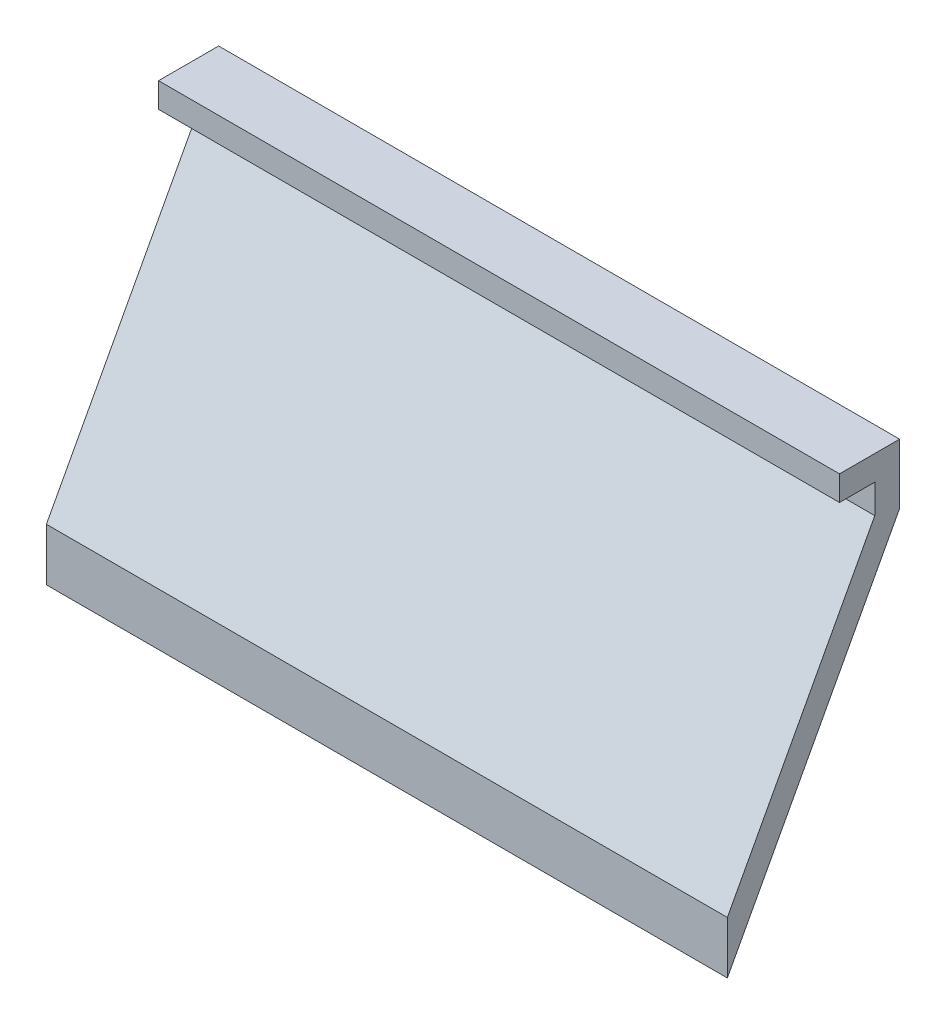
ISO-10303-21;
HEADER;
FILE_DESCRIPTION(('STEP AP214'),'2;1');
FILE_NAME('part.step','',(''),(''),'','','');
FILE_SCHEMA(('AUTOMOTIVE_DESIGN { 1 0 10303 214 1 1 1 1 }'));
ENDSEC;
DATA;
#1=APPLICATION_CONTEXT('core data for automotive mechanical design processes');
#2=APPLICATION_PROTOCOL_DEFINITION('international standard','automotive_design',2000,#1);
#3=PRODUCT_CONTEXT('',#1,'mechanical');
#4=PRODUCT('Part','Part','',(#3));
#5=PRODUCT_RELATED_PRODUCT_CATEGORY('part','',(#4));
#6=PRODUCT_DEFINITION_FORMATION('','',#4);
#7=PRODUCT_DEFINITION_CONTEXT('part definition',#1,'design');
#8=PRODUCT_DEFINITION('design','',#6,#7);
#9=PRODUCT_DEFINITION_SHAPE('','',#8);
#10=(LENGTH_UNIT() NAMED_UNIT(*) SI_UNIT(.MILLI.,.METRE.));
#11=(NAMED_UNIT(*) PLANE_ANGLE_UNIT() SI_UNIT($,.RADIAN.));
#12=(NAMED_UNIT(*) SI_UNIT($,.STERADIAN.) SOLID_ANGLE_UNIT());
#13=UNCERTAINTY_MEASURE_WITH_UNIT(LENGTH_MEASURE(1.E-05),#10,'distance_accuracy_value','');
#14=(GEOMETRIC_REPRESENTATION_CONTEXT(3) GLOBAL_UNCERTAINTY_ASSIGNED_CONTEXT((#13)) GLOBAL_UNIT_ASSIGNED_CONTEXT((#10,
#11,#12)) REPRESENTATION_CONTEXT('',''));
#15=CARTESIAN_POINT('',(0.,0.,0.));
#16=DIRECTION('',(0.,0.,1.));
#17=DIRECTION('',(1.,0.,0.));
#18=AXIS2_PLACEMENT_3D('',#15,#16,#17);
#19=CARTESIAN_POINT('',(85.,55.,-21.5));
#20=DIRECTION('',(0.,-1.,0.));
#21=DIRECTION('',(0.,0.,-1.));
#22=AXIS2_PLACEMENT_3D('',#19,#20,#21);
#23=PLANE('',#22);
#24=DIRECTION('',(0.,0.,1.));
#25=VECTOR('',#24,1.);
#26=CARTESIAN_POINT('',(-85.,55.,-21.5));
#27=LINE('',#26,#25);
#28=CARTESIAN_POINT('',(-85.,55.,-21.5));
#29=VERTEX_POINT('',#28);
#30=CARTESIAN_POINT('',(-85.,55.,-6.5));
#31=VERTEX_POINT('',#30);
#32=EDGE_CURVE('E128',#29,#31,#27,.T.);
#33=ORIENTED_EDGE('',*,*,#32,.T.);
#34=DIRECTION('',(-1.,0.,0.));
#35=VECTOR('',#34,1.);
#36=CARTESIAN_POINT('',(85.,55.,-6.5));
#37=LINE('',#36,#35);
#38=CARTESIAN_POINT('',(85.,55.,-6.5));
#39=VERTEX_POINT('',#38);
#40=EDGE_CURVE('E11',#39,#31,#37,.T.);
#41=ORIENTED_EDGE('',*,*,#40,.F.);
#42=DIRECTION('',(0.,0.,1.));
#43=VECTOR('',#42,1.);
#44=CARTESIAN_POINT('',(85.,55.,-21.5));
#45=LINE('',#44,#43);
#46=CARTESIAN_POINT('',(85.,55.,-21.5));
#47=VERTEX_POINT('',#46);
#48=EDGE_CURVE('E142',#47,#39,#45,.T.);
#49=ORIENTED_EDGE('',*,*,#48,.F.);
#50=DIRECTION('',(-1.,0.,0.));
#51=VECTOR('',#50,1.);
#52=CARTESIAN_POINT('',(85.,55.,-21.5));
#53=LINE('',#52,#51);
#54=EDGE_CURVE('E124',#47,#29,#53,.T.);
#55=ORIENTED_EDGE('',*,*,#54,.T.);
#56=EDGE_LOOP('',(#33,#41,#49,#55));
#57=FACE_BOUND('',#56,.T.);
#58=ADVANCED_FACE('F32',(#57),#23,.F.);
#59=CARTESIAN_POINT('',(85.,55.,-6.5));
#60=DIRECTION('',(0.,0.,-1.));
#61=DIRECTION('',(0.,1.,0.));
#62=AXIS2_PLACEMENT_3D('',#59,#60,#61);
#63=PLANE('',#62);
#64=DIRECTION('',(0.,-1.,0.));
#65=VECTOR('',#64,1.);
#66=CARTESIAN_POINT('',(-85.,55.,-6.5));
#67=LINE('',#66,#65);
#68=CARTESIAN_POINT('',(-85.,48.8,-6.5));
#69=VERTEX_POINT('',#68);
#70=EDGE_CURVE('E131',#31,#69,#67,.T.);
#71=ORIENTED_EDGE('',*,*,#70,.T.);
#72=DIRECTION('',(-1.,0.,0.));
#73=VECTOR('',#72,1.);
#74=CARTESIAN_POINT('',(85.,48.8,-6.5));
#75=LINE('',#74,#73);
#76=CARTESIAN_POINT('',(85.,48.8,-6.5));
#77=VERTEX_POINT('',#76);
#78=EDGE_CURVE('E40',#77,#69,#75,.T.);
#79=ORIENTED_EDGE('',*,*,#78,.F.);
#80=DIRECTION('',(0.,-1.,0.));
#81=VECTOR('',#80,1.);
#82=CARTESIAN_POINT('',(85.,55.,-6.5));
#83=LINE('',#82,#81);
#84=EDGE_CURVE('E91',#39,#77,#83,.T.);
#85=ORIENTED_EDGE('',*,*,#84,.F.);
#86=ORIENTED_EDGE('',*,*,#40,.T.);
#87=EDGE_LOOP('',(#71,#79,#85,#86));
#88=FACE_BOUND('',#87,.T.);
#89=ADVANCED_FACE('F177',(#88),#63,.F.);
#90=CARTESIAN_POINT('',(85.,48.8,-6.5));
#91=DIRECTION('',(0.,1.,0.));
#92=DIRECTION('',(0.,0.,1.));
#93=AXIS2_PLACEMENT_3D('',#90,#91,#92);
#94=PLANE('',#93);
#95=DIRECTION('',(0.,0.,-1.));
#96=VECTOR('',#95,1.);
#97=CARTESIAN_POINT('',(-85.,48.8,-6.5));
#98=LINE('',#97,#96);
#99=CARTESIAN_POINT('',(-85.,48.8,-15.3));
#100=VERTEX_POINT('',#99);
#101=EDGE_CURVE('E133',#69,#100,#98,.T.);
#102=ORIENTED_EDGE('',*,*,#101,.T.);
#103=DIRECTION('',(-1.,0.,0.));
#104=VECTOR('',#103,1.);
#105=CARTESIAN_POINT('',(85.,48.8,-15.3));
#106=LINE('',#105,#104);
#107=CARTESIAN_POINT('',(85.,48.8,-15.3));
#108=VERTEX_POINT('',#107);
#109=EDGE_CURVE('E149',#108,#100,#106,.T.);
#110=ORIENTED_EDGE('',*,*,#109,.F.);
#111=DIRECTION('',(0.,0.,-1.));
#112=VECTOR('',#111,1.);
#113=CARTESIAN_POINT('',(85.,48.8,-6.5));
#114=LINE('',#113,#112);
#115=EDGE_CURVE('E157',#77,#108,#114,.T.);
#116=ORIENTED_EDGE('',*,*,#115,.F.);
#117=ORIENTED_EDGE('',*,*,#78,.T.);
#118=EDGE_LOOP('',(#102,#110,#116,#117));
#119=FACE_BOUND('',#118,.T.);
#120=ADVANCED_FACE('F155',(#119),#94,.F.);
#121=CARTESIAN_POINT('',(85.,41.5606705802585,-15.3));
#122=DIRECTION('',(0.,0.,-1.));
#123=DIRECTION('',(0.,1.,0.));
#124=AXIS2_PLACEMENT_3D('',#121,#122,#123);
#125=PLANE('',#124);
#126=DIRECTION('',(0.,-1.,0.));
#127=VECTOR('',#126,1.);
#128=CARTESIAN_POINT('',(-85.,41.5606705802585,-15.3));
#129=LINE('',#128,#127);
#130=CARTESIAN_POINT('',(-85.,41.5606705802585,-15.3));
#131=VERTEX_POINT('',#130);
#132=EDGE_CURVE('E135',#100,#131,#129,.T.);
#133=ORIENTED_EDGE('',*,*,#132,.T.);
#134=DIRECTION('',(-1.,0.,0.));
#135=VECTOR('',#134,1.);
#136=CARTESIAN_POINT('',(85.,41.5606705802585,-15.3));
#137=LINE('',#136,#135);
#138=CARTESIAN_POINT('',(85.,41.5606705802585,-15.3));
#139=VERTEX_POINT('',#138);
#140=EDGE_CURVE('E146',#139,#131,#137,.T.);
#141=ORIENTED_EDGE('',*,*,#140,.F.);
#142=DIRECTION('',(0.,-1.,0.));
#143=VECTOR('',#142,1.);
#144=CARTESIAN_POINT('',(85.,41.5606705802585,-15.3));
#145=LINE('',#144,#143);
#146=EDGE_CURVE('E169',#108,#139,#145,.T.);
#147=ORIENTED_EDGE('',*,*,#146,.F.);
#148=ORIENTED_EDGE('',*,*,#109,.T.);
#149=EDGE_LOOP('',(#133,#141,#147,#148));
#150=FACE_BOUND('',#149,.T.);
#151=ADVANCED_FACE('F165',(#150),#125,.F.);
#152=CARTESIAN_POINT('',(85.,-26.9044456988113,21.5));
#153=DIRECTION('',(0.,-0.473443113395912,-0.880824397015651));
#154=DIRECTION('',(0.,0.880824397015651,-0.473443113395912));
#155=AXIS2_PLACEMENT_3D('',#152,#153,#154);
#156=PLANE('',#155);
#157=DIRECTION('',(0.,-0.880824397015651,0.473443113395912));
#158=VECTOR('',#157,1.);
#159=CARTESIAN_POINT('',(-85.,-26.9044456988113,21.5));
#160=LINE('',#159,#158);
#161=CARTESIAN_POINT('',(-85.,-26.9044456988113,21.5));
#162=VERTEX_POINT('',#161);
#163=EDGE_CURVE('E137',#131,#162,#160,.T.);
#164=ORIENTED_EDGE('',*,*,#163,.T.);
#165=DIRECTION('',(-1.,0.,0.));
#166=VECTOR('',#165,1.);
#167=CARTESIAN_POINT('',(85.,-26.9044456988113,21.5));
#168=LINE('',#167,#166);
#169=CARTESIAN_POINT('',(85.,-26.9044456988113,21.5));
#170=VERTEX_POINT('',#169);
#171=EDGE_CURVE('E119',#170,#162,#168,.T.);
#172=ORIENTED_EDGE('',*,*,#171,.F.);
#173=DIRECTION('',(0.,-0.880824397015651,0.473443113395912));
#174=VECTOR('',#173,1.);
#175=CARTESIAN_POINT('',(85.,-26.9044456988113,21.5));
#176=LINE('',#175,#174);
#177=EDGE_CURVE('E110',#139,#170,#176,.T.);
#178=ORIENTED_EDGE('',*,*,#177,.F.);
#179=ORIENTED_EDGE('',*,*,#140,.T.);
#180=EDGE_LOOP('',(#164,#172,#178,#179));
#181=FACE_BOUND('',#180,.T.);
#182=ADVANCED_FACE('F168',(#181),#156,.F.);
#183=CARTESIAN_POINT('',(85.,-40.,21.5));
#184=DIRECTION('',(0.,0.,-1.));
#185=DIRECTION('',(-1.,0.,0.));
#186=AXIS2_PLACEMENT_3D('',#183,#184,#185);
#187=PLANE('',#186);
#188=DIRECTION('',(0.,-1.,0.));
#189=VECTOR('',#188,1.);
#190=CARTESIAN_POINT('',(-85.,-40.,21.5));
#191=LINE('',#190,#189);
#192=CARTESIAN_POINT('',(-85.,-40.,21.5));
#193=VERTEX_POINT('',#192);
#194=EDGE_CURVE('E118',#162,#193,#191,.T.);
#195=ORIENTED_EDGE('',*,*,#194,.T.);
#196=DIRECTION('',(-1.,0.,0.));
#197=VECTOR('',#196,1.);
#198=CARTESIAN_POINT('',(85.,-40.,21.5));
#199=LINE('',#198,#197);
#200=CARTESIAN_POINT('',(85.,-40.,21.5));
#201=VERTEX_POINT('',#200);
#202=EDGE_CURVE('E115',#201,#193,#199,.T.);
#203=ORIENTED_EDGE('',*,*,#202,.F.);
#204=DIRECTION('',(0.,-1.,0.));
#205=VECTOR('',#204,1.);
#206=CARTESIAN_POINT('',(85.,-40.,21.5));
#207=LINE('',#206,#205);
#208=EDGE_CURVE('E104',#170,#201,#207,.T.);
#209=ORIENTED_EDGE('',*,*,#208,.F.);
#210=ORIENTED_EDGE('',*,*,#171,.T.);
#211=EDGE_LOOP('',(#195,#203,#209,#210));
#212=FACE_BOUND('',#211,.T.);
#213=ADVANCED_FACE('F116',(#212),#187,.F.);
#214=CARTESIAN_POINT('',(85.,40.,-21.5));
#215=DIRECTION('',(0.,0.473443113395912,0.880824397015651));
#216=DIRECTION('',(0.,-0.880824397015651,0.473443113395912));
#217=AXIS2_PLACEMENT_3D('',#214,#215,#216);
#218=PLANE('',#217);
#219=DIRECTION('',(0.,0.880824397015651,-0.473443113395912));
#220=VECTOR('',#219,1.);
#221=CARTESIAN_POINT('',(-85.,40.,-21.5));
#222=LINE('',#221,#220);
#223=CARTESIAN_POINT('',(-85.,40.,-21.5));
#224=VERTEX_POINT('',#223);
#225=EDGE_CURVE('E77',#193,#224,#222,.T.);
#226=ORIENTED_EDGE('',*,*,#225,.T.);
#227=DIRECTION('',(-1.,0.,0.));
#228=VECTOR('',#227,1.);
#229=CARTESIAN_POINT('',(85.,40.,-21.5));
#230=LINE('',#229,#228);
#231=CARTESIAN_POINT('',(85.,40.,-21.5));
#232=VERTEX_POINT('',#231);
#233=EDGE_CURVE('E120',#232,#224,#230,.T.);
#234=ORIENTED_EDGE('',*,*,#233,.F.);
#235=DIRECTION('',(0.,0.880824397015651,-0.473443113395912));
#236=VECTOR('',#235,1.);
#237=CARTESIAN_POINT('',(85.,40.,-21.5));
#238=LINE('',#237,#236);
#239=EDGE_CURVE('E108',#201,#232,#238,.T.);
#240=ORIENTED_EDGE('',*,*,#239,.F.);
#241=ORIENTED_EDGE('',*,*,#202,.T.);
#242=EDGE_LOOP('',(#226,#234,#240,#241));
#243=FACE_BOUND('',#242,.T.);
#244=ADVANCED_FACE('F122',(#243),#218,.F.);
#245=CARTESIAN_POINT('',(85.,55.,-21.5));
#246=DIRECTION('',(0.,0.,1.));
#247=DIRECTION('',(0.,-1.,0.));
#248=AXIS2_PLACEMENT_3D('',#245,#246,#247);
#249=PLANE('',#248);
#250=DIRECTION('',(0.,1.,0.));
#251=VECTOR('',#250,1.);
#252=CARTESIAN_POINT('',(-85.,55.,-21.5));
#253=LINE('',#252,#251);
#254=EDGE_CURVE('E83',#224,#29,#253,.T.);
#255=ORIENTED_EDGE('',*,*,#254,.T.);
#256=ORIENTED_EDGE('',*,*,#54,.F.);
#257=DIRECTION('',(0.,1.,0.));
#258=VECTOR('',#257,1.);
#259=CARTESIAN_POINT('',(85.,55.,-21.5));
#260=LINE('',#259,#258);
#261=EDGE_CURVE('E48',#232,#47,#260,.T.);
#262=ORIENTED_EDGE('',*,*,#261,.F.);
#263=ORIENTED_EDGE('',*,*,#233,.T.);
#264=EDGE_LOOP('',(#255,#256,#262,#263));
#265=FACE_BOUND('',#264,.T.);
#266=ADVANCED_FACE('F193',(#265),#249,.F.);
#267=CARTESIAN_POINT('',(85.,0.,0.));
#268=DIRECTION('',(1.,0.,0.));
#269=DIRECTION('',(0.,0.,-1.));
#270=AXIS2_PLACEMENT_3D('',#267,#268,#269);
#271=PLANE('',#270);
#272=ORIENTED_EDGE('',*,*,#48,.T.);
#273=ORIENTED_EDGE('',*,*,#84,.T.);
#274=ORIENTED_EDGE('',*,*,#115,.T.);
#275=ORIENTED_EDGE('',*,*,#146,.T.);
#276=ORIENTED_EDGE('',*,*,#177,.T.);
#277=ORIENTED_EDGE('',*,*,#208,.T.);
#278=ORIENTED_EDGE('',*,*,#239,.T.);
#279=ORIENTED_EDGE('',*,*,#261,.T.);
#280=EDGE_LOOP('',(#272,#273,#274,#275,#276,#277,#278,#279));
#281=FACE_BOUND('',#280,.T.);
#282=ADVANCED_FACE('F106',(#281),#271,.T.);
#283=CARTESIAN_POINT('',(-85.,0.,0.));
#284=DIRECTION('',(1.,0.,0.));
#285=DIRECTION('',(0.,0.,-1.));
#286=AXIS2_PLACEMENT_3D('',#283,#284,#285);
#287=PLANE('',#286);
#288=ORIENTED_EDGE('',*,*,#32,.F.);
#289=ORIENTED_EDGE('',*,*,#254,.F.);
#290=ORIENTED_EDGE('',*,*,#225,.F.);
#291=ORIENTED_EDGE('',*,*,#194,.F.);
#292=ORIENTED_EDGE('',*,*,#163,.F.);
#293=ORIENTED_EDGE('',*,*,#132,.F.);
#294=ORIENTED_EDGE('',*,*,#101,.F.);
#295=ORIENTED_EDGE('',*,*,#70,.F.);
#296=EDGE_LOOP('',(#288,#289,#290,#291,#292,#293,#294,#295));
#297=FACE_BOUND('',#296,.T.);
#298=ADVANCED_FACE('F161',(#297),#287,.F.);
#299=CLOSED_SHELL('',(#58,#89,#120,#151,#182,#213,#244,#266,#282,#298));
#300=MANIFOLD_SOLID_BREP('B2',#299);
#301=ADVANCED_BREP_SHAPE_REPRESENTATION('',(#18,#300),#14);
#302=SHAPE_DEFINITION_REPRESENTATION(#9,#301);
ENDSEC;
END-ISO-10303-21;
